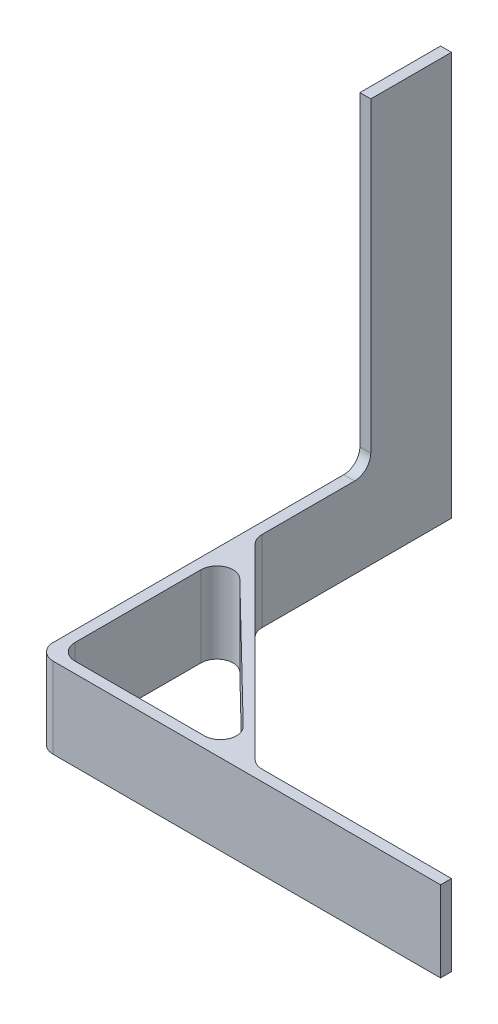
ISO-10303-21;
HEADER;
FILE_DESCRIPTION(('STEP AP214'),'2;1');
FILE_NAME('part.step','',(''),(''),'','','');
FILE_SCHEMA(('AUTOMOTIVE_DESIGN { 1 0 10303 214 1 1 1 1 }'));
ENDSEC;
DATA;
#1=APPLICATION_CONTEXT('core data for automotive mechanical design processes');
#2=APPLICATION_PROTOCOL_DEFINITION('international standard','automotive_design',2000,#1);
#3=PRODUCT_CONTEXT('',#1,'mechanical');
#4=PRODUCT('Part','Part','',(#3));
#5=PRODUCT_RELATED_PRODUCT_CATEGORY('part','',(#4));
#6=PRODUCT_DEFINITION_FORMATION('','',#4);
#7=PRODUCT_DEFINITION_CONTEXT('part definition',#1,'design');
#8=PRODUCT_DEFINITION('design','',#6,#7);
#9=PRODUCT_DEFINITION_SHAPE('','',#8);
#10=(LENGTH_UNIT() NAMED_UNIT(*) SI_UNIT(.MILLI.,.METRE.));
#11=(NAMED_UNIT(*) PLANE_ANGLE_UNIT() SI_UNIT($,.RADIAN.));
#12=(NAMED_UNIT(*) SI_UNIT($,.STERADIAN.) SOLID_ANGLE_UNIT());
#13=UNCERTAINTY_MEASURE_WITH_UNIT(LENGTH_MEASURE(1.E-05),#10,'distance_accuracy_value','');
#14=(GEOMETRIC_REPRESENTATION_CONTEXT(3) GLOBAL_UNCERTAINTY_ASSIGNED_CONTEXT((#13)) GLOBAL_UNIT_ASSIGNED_CONTEXT((#10,
#11,#12)) REPRESENTATION_CONTEXT('',''));
#15=CARTESIAN_POINT('',(0.,0.,0.));
#16=DIRECTION('',(0.,0.,1.));
#17=DIRECTION('',(1.,0.,0.));
#18=AXIS2_PLACEMENT_3D('',#15,#16,#17);
#19=CARTESIAN_POINT('',(0.,50.,0.));
#20=DIRECTION('',(0.,1.,0.));
#21=DIRECTION('',(0.,0.,1.));
#22=AXIS2_PLACEMENT_3D('',#19,#20,#21);
#23=PLANE('',#22);
#24=DIRECTION('',(0.,0.,-1.));
#25=VECTOR('',#24,1.);
#26=CARTESIAN_POINT('',(-243.25,50.,0.));
#27=LINE('',#26,#25);
#28=CARTESIAN_POINT('',(-243.25,50.,-16.7539621198595));
#29=VERTEX_POINT('',#28);
#30=CARTESIAN_POINT('',(-243.25,50.,-94.7328861396077));
#31=VERTEX_POINT('',#30);
#32=EDGE_CURVE('E197',#29,#31,#27,.T.);
#33=ORIENTED_EDGE('',*,*,#32,.T.);
#34=CARTESIAN_POINT('',(-233.25,50.,-94.7328861396077));
#35=DIRECTION('',(0.,1.,0.));
#36=DIRECTION('',(0.,0.,1.));
#37=AXIS2_PLACEMENT_3D('',#34,#35,#36);
#38=CIRCLE('',#37,10.);
#39=CARTESIAN_POINT('',(-226.273738928772,50.,-101.897506259759));
#40=VERTEX_POINT('',#39);
#41=EDGE_CURVE('E269',#31,#40,#38,.F.);
#42=ORIENTED_EDGE('',*,*,#41,.T.);
#43=DIRECTION('',(0.716462012015094,0.,0.697626107122779));
#44=VECTOR('',#43,1.);
#45=CARTESIAN_POINT('',(-121.625,50.,0.));
#46=LINE('',#45,#44);
#47=CARTESIAN_POINT('',(-146.189383960491,50.,-23.9185822400105));
#48=VERTEX_POINT('',#47);
#49=EDGE_CURVE('E188',#40,#48,#46,.T.);
#50=ORIENTED_EDGE('',*,*,#49,.T.);
#51=CARTESIAN_POINT('',(-153.165645031719,50.,-16.7539621198596));
#52=DIRECTION('',(0.,1.,0.));
#53=DIRECTION('',(0.,0.,1.));
#54=AXIS2_PLACEMENT_3D('',#51,#52,#53);
#55=CIRCLE('',#54,10.);
#56=CARTESIAN_POINT('',(-153.165645031719,50.,-6.75396211985955));
#57=VERTEX_POINT('',#56);
#58=EDGE_CURVE('E276',#48,#57,#55,.F.);
#59=ORIENTED_EDGE('',*,*,#58,.T.);
#60=DIRECTION('',(-1.,0.,0.));
#61=VECTOR('',#60,1.);
#62=CARTESIAN_POINT('',(0.,50.,-6.75396211985957));
#63=LINE('',#62,#61);
#64=CARTESIAN_POINT('',(-233.25,50.,-6.75396211985954));
#65=VERTEX_POINT('',#64);
#66=EDGE_CURVE('E216',#57,#65,#63,.T.);
#67=ORIENTED_EDGE('',*,*,#66,.T.);
#68=CARTESIAN_POINT('',(-233.25,50.,-16.7539621198595));
#69=DIRECTION('',(0.,1.,0.));
#70=DIRECTION('',(0.,0.,1.));
#71=AXIS2_PLACEMENT_3D('',#68,#69,#70);
#72=CIRCLE('',#71,10.);
#73=EDGE_CURVE('E260',#65,#29,#72,.F.);
#74=ORIENTED_EDGE('',*,*,#73,.T.);
#75=EDGE_LOOP('',(#33,#42,#50,#59,#67,#74));
#76=FACE_BOUND('',#75,.T.);
#77=CARTESIAN_POINT('',(-243.25,50.,-132.519164391346));
#78=VERTEX_POINT('',#77);
#79=CARTESIAN_POINT('',(-243.25,50.,-190.));
#80=VERTEX_POINT('',#79);
#81=EDGE_CURVE('E201',#78,#80,#27,.T.);
#82=ORIENTED_EDGE('',*,*,#81,.T.);
#83=DIRECTION('',(-1.,0.,0.));
#84=VECTOR('',#83,1.);
#85=CARTESIAN_POINT('',(0.,50.,-190.));
#86=LINE('',#85,#84);
#87=CARTESIAN_POINT('',(-250.,50.,-190.));
#88=VERTEX_POINT('',#87);
#89=EDGE_CURVE('E298',#80,#88,#86,.T.);
#90=ORIENTED_EDGE('',*,*,#89,.T.);
#91=DIRECTION('',(0.,0.,1.));
#92=VECTOR('',#91,1.);
#93=CARTESIAN_POINT('',(-250.,50.,0.));
#94=LINE('',#93,#92);
#95=CARTESIAN_POINT('',(-250.,50.,-9.99999999999997));
#96=VERTEX_POINT('',#95);
#97=EDGE_CURVE('E221',#88,#96,#94,.T.);
#98=ORIENTED_EDGE('',*,*,#97,.T.);
#99=CARTESIAN_POINT('',(-240.,50.,-9.99999999999997));
#100=DIRECTION('',(0.,1.,0.));
#101=DIRECTION('',(0.,0.,1.));
#102=AXIS2_PLACEMENT_3D('',#99,#100,#101);
#103=CIRCLE('',#102,10.);
#104=CARTESIAN_POINT('',(-240.,50.,0.));
#105=VERTEX_POINT('',#104);
#106=EDGE_CURVE('E249',#96,#105,#103,.T.);
#107=ORIENTED_EDGE('',*,*,#106,.T.);
#108=DIRECTION('',(1.,0.,0.));
#109=VECTOR('',#108,1.);
#110=CARTESIAN_POINT('',(0.,50.,0.));
#111=LINE('',#110,#109);
#112=CARTESIAN_POINT('',(0.,50.,0.));
#113=VERTEX_POINT('',#112);
#114=EDGE_CURVE('E223',#105,#113,#111,.T.);
#115=ORIENTED_EDGE('',*,*,#114,.T.);
#116=DIRECTION('',(0.,0.,-1.));
#117=VECTOR('',#116,1.);
#118=CARTESIAN_POINT('',(0.,50.,0.));
#119=LINE('',#118,#117);
#120=CARTESIAN_POINT('',(0.,50.,-6.75396211985957));
#121=VERTEX_POINT('',#120);
#122=EDGE_CURVE('E213',#113,#121,#119,.T.);
#123=ORIENTED_EDGE('',*,*,#122,.T.);
#124=CARTESIAN_POINT('',(-117.482912083794,50.,-6.75396211985955));
#125=VERTEX_POINT('',#124);
#126=EDGE_CURVE('E218',#121,#125,#63,.T.);
#127=ORIENTED_EDGE('',*,*,#126,.T.);
#128=CARTESIAN_POINT('',(-117.482912083794,50.,-16.7539621198596));
#129=DIRECTION('',(0.,1.,0.));
#130=DIRECTION('',(0.,0.,1.));
#131=AXIS2_PLACEMENT_3D('',#128,#129,#130);
#132=CIRCLE('',#131,10.);
#133=CARTESIAN_POINT('',(-124.553922307251,50.,-9.68283672005514));
#134=VERTEX_POINT('',#133);
#135=EDGE_CURVE('E287',#125,#134,#132,.F.);
#136=ORIENTED_EDGE('',*,*,#135,.T.);
#137=DIRECTION('',(-0.707112539980441,0.,-0.707101022345754));
#138=VECTOR('',#137,1.);
#139=CARTESIAN_POINT('',(-243.25,50.,-128.37698105993));
#140=LINE('',#139,#138);
#141=CARTESIAN_POINT('',(-240.321010223458,50.,-125.448038991542));
#142=VERTEX_POINT('',#141);
#143=EDGE_CURVE('E191',#134,#142,#140,.T.);
#144=ORIENTED_EDGE('',*,*,#143,.T.);
#145=CARTESIAN_POINT('',(-233.25,50.,-132.519164391346));
#146=DIRECTION('',(0.,1.,0.));
#147=DIRECTION('',(0.,0.,1.));
#148=AXIS2_PLACEMENT_3D('',#145,#146,#147);
#149=CIRCLE('',#148,10.);
#150=EDGE_CURVE('E296',#142,#78,#149,.F.);
#151=ORIENTED_EDGE('',*,*,#150,.T.);
#152=EDGE_LOOP('',(#82,#90,#98,#107,#115,#123,#127,#136,#144,#151));
#153=FACE_BOUND('',#152,.T.);
#154=ADVANCED_FACE('F33',(#76,#153),#23,.T.);
#155=CARTESIAN_POINT('',(0.,50.,-6.75396211985957));
#156=DIRECTION('',(0.,0.,1.));
#157=DIRECTION('',(1.,0.,0.));
#158=AXIS2_PLACEMENT_3D('',#155,#156,#157);
#159=PLANE('',#158);
#160=ORIENTED_EDGE('',*,*,#66,.F.);
#161=DIRECTION('',(0.,1.,0.));
#162=VECTOR('',#161,1.);
#163=CARTESIAN_POINT('',(-153.165645031719,0.,-6.75396211985955));
#164=LINE('',#163,#162);
#165=CARTESIAN_POINT('',(-153.165645031719,0.,-6.75396211985955));
#166=VERTEX_POINT('',#165);
#167=EDGE_CURVE('E274',#57,#166,#164,.F.);
#168=ORIENTED_EDGE('',*,*,#167,.T.);
#169=DIRECTION('',(-1.,0.,0.));
#170=VECTOR('',#169,1.);
#171=CARTESIAN_POINT('',(0.,0.,-6.75396211985957));
#172=LINE('',#171,#170);
#173=CARTESIAN_POINT('',(-233.25,0.,-6.75396211985954));
#174=VERTEX_POINT('',#173);
#175=EDGE_CURVE('E228',#166,#174,#172,.T.);
#176=ORIENTED_EDGE('',*,*,#175,.T.);
#177=DIRECTION('',(0.,-1.,0.));
#178=VECTOR('',#177,1.);
#179=CARTESIAN_POINT('',(-233.25,50.,-6.75396211985954));
#180=LINE('',#179,#178);
#181=EDGE_CURVE('E254',#174,#65,#180,.F.);
#182=ORIENTED_EDGE('',*,*,#181,.T.);
#183=EDGE_LOOP('',(#160,#168,#176,#182));
#184=FACE_BOUND('',#183,.T.);
#185=ADVANCED_FACE('F350',(#184),#159,.F.);
#186=CARTESIAN_POINT('',(0.,0.,-6.75396211985957));
#187=VERTEX_POINT('',#186);
#188=CARTESIAN_POINT('',(-117.482912083794,0.,-6.75396211985955));
#189=VERTEX_POINT('',#188);
#190=EDGE_CURVE('E229',#187,#189,#172,.T.);
#191=ORIENTED_EDGE('',*,*,#190,.T.);
#192=DIRECTION('',(0.,-1.,0.));
#193=VECTOR('',#192,1.);
#194=CARTESIAN_POINT('',(-117.482912083794,50.,-6.75396211985955));
#195=LINE('',#194,#193);
#196=EDGE_CURVE('E283',#189,#125,#195,.F.);
#197=ORIENTED_EDGE('',*,*,#196,.T.);
#198=ORIENTED_EDGE('',*,*,#126,.F.);
#199=DIRECTION('',(0.,-1.,0.));
#200=VECTOR('',#199,1.);
#201=CARTESIAN_POINT('',(0.,50.,-6.75396211985957));
#202=LINE('',#201,#200);
#203=EDGE_CURVE('E237',#121,#187,#202,.T.);
#204=ORIENTED_EDGE('',*,*,#203,.T.);
#205=EDGE_LOOP('',(#191,#197,#198,#204));
#206=FACE_BOUND('',#205,.T.);
#207=ADVANCED_FACE('F358',(#206),#159,.F.);
#208=CARTESIAN_POINT('',(-243.25,50.,0.));
#209=DIRECTION('',(-1.,0.,0.));
#210=DIRECTION('',(0.,0.,1.));
#211=AXIS2_PLACEMENT_3D('',#208,#209,#210);
#212=PLANE('',#211);
#213=DIRECTION('',(0.,0.,-1.));
#214=VECTOR('',#213,1.);
#215=CARTESIAN_POINT('',(-243.25,0.,0.));
#216=LINE('',#215,#214);
#217=CARTESIAN_POINT('',(-243.25,0.,-16.7539621198595));
#218=VERTEX_POINT('',#217);
#219=CARTESIAN_POINT('',(-243.25,0.,-94.7328861396077));
#220=VERTEX_POINT('',#219);
#221=EDGE_CURVE('E202',#218,#220,#216,.T.);
#222=ORIENTED_EDGE('',*,*,#221,.T.);
#223=DIRECTION('',(0.,-1.,0.));
#224=VECTOR('',#223,1.);
#225=CARTESIAN_POINT('',(-243.25,50.,-94.7328861396077));
#226=LINE('',#225,#224);
#227=EDGE_CURVE('E265',#220,#31,#226,.F.);
#228=ORIENTED_EDGE('',*,*,#227,.T.);
#229=ORIENTED_EDGE('',*,*,#32,.F.);
#230=DIRECTION('',(0.,-1.,0.));
#231=VECTOR('',#230,1.);
#232=CARTESIAN_POINT('',(-243.25,0.,-16.7539621198595));
#233=LINE('',#232,#231);
#234=EDGE_CURVE('E251',#29,#218,#233,.T.);
#235=ORIENTED_EDGE('',*,*,#234,.T.);
#236=EDGE_LOOP('',(#222,#228,#229,#235));
#237=FACE_BOUND('',#236,.T.);
#238=ADVANCED_FACE('F363',(#237),#212,.F.);
#239=DIRECTION('',(0.,-1.,0.));
#240=VECTOR('',#239,1.);
#241=CARTESIAN_POINT('',(-243.25,50.,-250.));
#242=LINE('',#241,#240);
#243=CARTESIAN_POINT('',(-243.25,250.,-250.));
#244=VERTEX_POINT('',#243);
#245=CARTESIAN_POINT('',(-243.25,0.,-250.));
#246=VERTEX_POINT('',#245);
#247=EDGE_CURVE('E209',#244,#246,#242,.T.);
#248=ORIENTED_EDGE('',*,*,#247,.F.);
#249=DIRECTION('',(0.,0.,-1.));
#250=VECTOR('',#249,1.);
#251=CARTESIAN_POINT('',(-243.25,250.,-250.));
#252=LINE('',#251,#250);
#253=CARTESIAN_POINT('',(-243.25,250.,-200.));
#254=VERTEX_POINT('',#253);
#255=EDGE_CURVE('E169',#254,#244,#252,.T.);
#256=ORIENTED_EDGE('',*,*,#255,.F.);
#257=DIRECTION('',(0.,-1.,0.));
#258=VECTOR('',#257,1.);
#259=CARTESIAN_POINT('',(-243.25,250.,-200.));
#260=LINE('',#259,#258);
#261=CARTESIAN_POINT('',(-243.25,60.,-200.));
#262=VERTEX_POINT('',#261);
#263=EDGE_CURVE('E165',#254,#262,#260,.T.);
#264=ORIENTED_EDGE('',*,*,#263,.T.);
#265=CARTESIAN_POINT('',(-243.25,60.,-190.));
#266=DIRECTION('',(-1.,0.,0.));
#267=DIRECTION('',(0.,0.,1.));
#268=AXIS2_PLACEMENT_3D('',#265,#266,#267);
#269=CIRCLE('',#268,10.);
#270=EDGE_CURVE('E11',#262,#80,#269,.T.);
#271=ORIENTED_EDGE('',*,*,#270,.T.);
#272=ORIENTED_EDGE('',*,*,#81,.F.);
#273=DIRECTION('',(0.,-1.,0.));
#274=VECTOR('',#273,1.);
#275=CARTESIAN_POINT('',(-243.25,0.,-132.519164391346));
#276=LINE('',#275,#274);
#277=CARTESIAN_POINT('',(-243.25,0.,-132.519164391346));
#278=VERTEX_POINT('',#277);
#279=EDGE_CURVE('E289',#78,#278,#276,.T.);
#280=ORIENTED_EDGE('',*,*,#279,.T.);
#281=EDGE_CURVE('E193',#278,#246,#216,.T.);
#282=ORIENTED_EDGE('',*,*,#281,.T.);
#283=EDGE_LOOP('',(#248,#256,#264,#271,#272,#280,#282));
#284=FACE_BOUND('',#283,.T.);
#285=ADVANCED_FACE('F343',(#284),#212,.F.);
#286=CARTESIAN_POINT('',(0.,50.,0.));
#287=DIRECTION('',(-1.,0.,0.));
#288=DIRECTION('',(0.,0.,1.));
#289=AXIS2_PLACEMENT_3D('',#286,#287,#288);
#290=PLANE('',#289);
#291=DIRECTION('',(0.,0.,-1.));
#292=VECTOR('',#291,1.);
#293=CARTESIAN_POINT('',(0.,0.,0.));
#294=LINE('',#293,#292);
#295=CARTESIAN_POINT('',(0.,0.,0.));
#296=VERTEX_POINT('',#295);
#297=EDGE_CURVE('E212',#296,#187,#294,.T.);
#298=ORIENTED_EDGE('',*,*,#297,.T.);
#299=ORIENTED_EDGE('',*,*,#203,.F.);
#300=ORIENTED_EDGE('',*,*,#122,.F.);
#301=DIRECTION('',(0.,-1.,0.));
#302=VECTOR('',#301,1.);
#303=CARTESIAN_POINT('',(0.,50.,0.));
#304=LINE('',#303,#302);
#305=EDGE_CURVE('E225',#113,#296,#304,.T.);
#306=ORIENTED_EDGE('',*,*,#305,.T.);
#307=EDGE_LOOP('',(#298,#299,#300,#306));
#308=FACE_BOUND('',#307,.T.);
#309=ADVANCED_FACE('F321',(#308),#290,.F.);
#310=CARTESIAN_POINT('',(-250.,50.,0.));
#311=DIRECTION('',(1.,0.,0.));
#312=DIRECTION('',(0.,0.,-1.));
#313=AXIS2_PLACEMENT_3D('',#310,#311,#312);
#314=PLANE('',#313);
#315=DIRECTION('',(0.,0.,1.));
#316=VECTOR('',#315,1.);
#317=CARTESIAN_POINT('',(-250.,0.,0.));
#318=LINE('',#317,#316);
#319=CARTESIAN_POINT('',(-250.,0.,-250.));
#320=VERTEX_POINT('',#319);
#321=CARTESIAN_POINT('',(-250.,0.,-9.99999999999997));
#322=VERTEX_POINT('',#321);
#323=EDGE_CURVE('E232',#320,#322,#318,.T.);
#324=ORIENTED_EDGE('',*,*,#323,.T.);
#325=DIRECTION('',(0.,-1.,0.));
#326=VECTOR('',#325,1.);
#327=CARTESIAN_POINT('',(-250.,50.,-9.99999999999997));
#328=LINE('',#327,#326);
#329=EDGE_CURVE('E246',#322,#96,#328,.F.);
#330=ORIENTED_EDGE('',*,*,#329,.T.);
#331=ORIENTED_EDGE('',*,*,#97,.F.);
#332=CARTESIAN_POINT('',(-250.,60.,-190.));
#333=DIRECTION('',(1.,0.,0.));
#334=DIRECTION('',(0.,0.,-1.));
#335=AXIS2_PLACEMENT_3D('',#332,#333,#334);
#336=CIRCLE('',#335,10.);
#337=CARTESIAN_POINT('',(-250.,60.,-200.));
#338=VERTEX_POINT('',#337);
#339=EDGE_CURVE('E41',#88,#338,#336,.T.);
#340=ORIENTED_EDGE('',*,*,#339,.T.);
#341=DIRECTION('',(0.,-1.,0.));
#342=VECTOR('',#341,1.);
#343=CARTESIAN_POINT('',(-250.,250.,-200.));
#344=LINE('',#343,#342);
#345=CARTESIAN_POINT('',(-250.,250.,-200.));
#346=VERTEX_POINT('',#345);
#347=EDGE_CURVE('E164',#346,#338,#344,.T.);
#348=ORIENTED_EDGE('',*,*,#347,.F.);
#349=DIRECTION('',(0.,0.,1.));
#350=VECTOR('',#349,1.);
#351=CARTESIAN_POINT('',(-250.,250.,-250.));
#352=LINE('',#351,#350);
#353=CARTESIAN_POINT('',(-250.,250.,-250.));
#354=VERTEX_POINT('',#353);
#355=EDGE_CURVE('E170',#354,#346,#352,.T.);
#356=ORIENTED_EDGE('',*,*,#355,.F.);
#357=DIRECTION('',(0.,-1.,0.));
#358=VECTOR('',#357,1.);
#359=CARTESIAN_POINT('',(-250.,50.,-250.));
#360=LINE('',#359,#358);
#361=EDGE_CURVE('E200',#354,#320,#360,.T.);
#362=ORIENTED_EDGE('',*,*,#361,.T.);
#363=EDGE_LOOP('',(#324,#330,#331,#340,#348,#356,#362));
#364=FACE_BOUND('',#363,.T.);
#365=ADVANCED_FACE('F179',(#364),#314,.F.);
#366=CARTESIAN_POINT('',(0.,50.,0.));
#367=DIRECTION('',(0.,0.,-1.));
#368=DIRECTION('',(-1.,0.,0.));
#369=AXIS2_PLACEMENT_3D('',#366,#367,#368);
#370=PLANE('',#369);
#371=ORIENTED_EDGE('',*,*,#114,.F.);
#372=DIRECTION('',(0.,-1.,0.));
#373=VECTOR('',#372,1.);
#374=CARTESIAN_POINT('',(-240.,50.,0.));
#375=LINE('',#374,#373);
#376=CARTESIAN_POINT('',(-240.,0.,0.));
#377=VERTEX_POINT('',#376);
#378=EDGE_CURVE('E240',#105,#377,#375,.T.);
#379=ORIENTED_EDGE('',*,*,#378,.T.);
#380=DIRECTION('',(1.,0.,0.));
#381=VECTOR('',#380,1.);
#382=CARTESIAN_POINT('',(0.,0.,0.));
#383=LINE('',#382,#381);
#384=EDGE_CURVE('E217',#377,#296,#383,.T.);
#385=ORIENTED_EDGE('',*,*,#384,.T.);
#386=ORIENTED_EDGE('',*,*,#305,.F.);
#387=EDGE_LOOP('',(#371,#379,#385,#386));
#388=FACE_BOUND('',#387,.T.);
#389=ADVANCED_FACE('F315',(#388),#370,.F.);
#390=CARTESIAN_POINT('',(0.,0.,0.));
#391=DIRECTION('',(0.,1.,0.));
#392=DIRECTION('',(0.,0.,1.));
#393=AXIS2_PLACEMENT_3D('',#390,#391,#392);
#394=PLANE('',#393);
#395=DIRECTION('',(-1.,0.,0.));
#396=VECTOR('',#395,1.);
#397=CARTESIAN_POINT('',(-250.,0.,-250.));
#398=LINE('',#397,#396);
#399=EDGE_CURVE('E205',#246,#320,#398,.T.);
#400=ORIENTED_EDGE('',*,*,#399,.F.);
#401=ORIENTED_EDGE('',*,*,#281,.F.);
#402=CARTESIAN_POINT('',(-233.25,0.,-132.519164391346));
#403=DIRECTION('',(0.,1.,0.));
#404=DIRECTION('',(0.,0.,1.));
#405=AXIS2_PLACEMENT_3D('',#402,#403,#404);
#406=CIRCLE('',#405,10.);
#407=CARTESIAN_POINT('',(-240.321010223458,0.,-125.448038991542));
#408=VERTEX_POINT('',#407);
#409=EDGE_CURVE('E294',#278,#408,#406,.T.);
#410=ORIENTED_EDGE('',*,*,#409,.T.);
#411=DIRECTION('',(-0.707112539980441,0.,-0.707101022345754));
#412=VECTOR('',#411,1.);
#413=CARTESIAN_POINT('',(-243.25,0.,-128.37698105993));
#414=LINE('',#413,#412);
#415=CARTESIAN_POINT('',(-124.553922307251,0.,-9.68283672005514));
#416=VERTEX_POINT('',#415);
#417=EDGE_CURVE('E183',#416,#408,#414,.T.);
#418=ORIENTED_EDGE('',*,*,#417,.F.);
#419=CARTESIAN_POINT('',(-117.482912083794,0.,-16.7539621198596));
#420=DIRECTION('',(0.,1.,0.));
#421=DIRECTION('',(0.,0.,1.));
#422=AXIS2_PLACEMENT_3D('',#419,#420,#421);
#423=CIRCLE('',#422,10.);
#424=EDGE_CURVE('E285',#416,#189,#423,.T.);
#425=ORIENTED_EDGE('',*,*,#424,.T.);
#426=ORIENTED_EDGE('',*,*,#190,.F.);
#427=ORIENTED_EDGE('',*,*,#297,.F.);
#428=ORIENTED_EDGE('',*,*,#384,.F.);
#429=CARTESIAN_POINT('',(-240.,0.,-9.99999999999997));
#430=DIRECTION('',(0.,1.,0.));
#431=DIRECTION('',(0.,0.,1.));
#432=AXIS2_PLACEMENT_3D('',#429,#430,#431);
#433=CIRCLE('',#432,10.);
#434=EDGE_CURVE('E243',#377,#322,#433,.F.);
#435=ORIENTED_EDGE('',*,*,#434,.T.);
#436=ORIENTED_EDGE('',*,*,#323,.F.);
#437=EDGE_LOOP('',(#400,#401,#410,#418,#425,#426,#427,#428,#435,#436));
#438=FACE_BOUND('',#437,.T.);
#439=ORIENTED_EDGE('',*,*,#175,.F.);
#440=CARTESIAN_POINT('',(-153.165645031719,0.,-16.7539621198596));
#441=DIRECTION('',(0.,1.,0.));
#442=DIRECTION('',(0.,0.,1.));
#443=AXIS2_PLACEMENT_3D('',#440,#441,#442);
#444=CIRCLE('',#443,10.);
#445=CARTESIAN_POINT('',(-146.189383960491,0.,-23.9185822400105));
#446=VERTEX_POINT('',#445);
#447=EDGE_CURVE('E278',#166,#446,#444,.T.);
#448=ORIENTED_EDGE('',*,*,#447,.T.);
#449=DIRECTION('',(0.716462012015094,0.,0.697626107122779));
#450=VECTOR('',#449,1.);
#451=CARTESIAN_POINT('',(-121.625,0.,0.));
#452=LINE('',#451,#450);
#453=CARTESIAN_POINT('',(-226.273738928772,0.,-101.897506259759));
#454=VERTEX_POINT('',#453);
#455=EDGE_CURVE('E180',#454,#446,#452,.T.);
#456=ORIENTED_EDGE('',*,*,#455,.F.);
#457=CARTESIAN_POINT('',(-233.25,0.,-94.7328861396077));
#458=DIRECTION('',(0.,1.,0.));
#459=DIRECTION('',(0.,0.,1.));
#460=AXIS2_PLACEMENT_3D('',#457,#458,#459);
#461=CIRCLE('',#460,10.);
#462=EDGE_CURVE('E267',#454,#220,#461,.T.);
#463=ORIENTED_EDGE('',*,*,#462,.T.);
#464=ORIENTED_EDGE('',*,*,#221,.F.);
#465=CARTESIAN_POINT('',(-233.25,0.,-16.7539621198595));
#466=DIRECTION('',(0.,1.,0.));
#467=DIRECTION('',(0.,0.,1.));
#468=AXIS2_PLACEMENT_3D('',#465,#466,#467);
#469=CIRCLE('',#468,10.);
#470=EDGE_CURVE('E257',#218,#174,#469,.T.);
#471=ORIENTED_EDGE('',*,*,#470,.T.);
#472=EDGE_LOOP('',(#439,#448,#456,#463,#464,#471));
#473=FACE_BOUND('',#472,.T.);
#474=ADVANCED_FACE('F335',(#438,#473),#394,.F.);
#475=CARTESIAN_POINT('',(-250.,50.,-250.));
#476=DIRECTION('',(0.,0.,1.));
#477=DIRECTION('',(1.,0.,0.));
#478=AXIS2_PLACEMENT_3D('',#475,#476,#477);
#479=PLANE('',#478);
#480=ORIENTED_EDGE('',*,*,#399,.T.);
#481=ORIENTED_EDGE('',*,*,#361,.F.);
#482=DIRECTION('',(-1.,0.,0.));
#483=VECTOR('',#482,1.);
#484=CARTESIAN_POINT('',(-250.,250.,-250.));
#485=LINE('',#484,#483);
#486=EDGE_CURVE('E176',#244,#354,#485,.T.);
#487=ORIENTED_EDGE('',*,*,#486,.F.);
#488=ORIENTED_EDGE('',*,*,#247,.T.);
#489=EDGE_LOOP('',(#480,#481,#487,#488));
#490=FACE_BOUND('',#489,.T.);
#491=ADVANCED_FACE('F367',(#490),#479,.F.);
#492=CARTESIAN_POINT('',(-121.625,50.,0.));
#493=DIRECTION('',(0.697626107122779,0.,-0.716462012015094));
#494=DIRECTION('',(-0.716462012015094,0.,-0.697626107122779));
#495=AXIS2_PLACEMENT_3D('',#492,#493,#494);
#496=PLANE('',#495);
#497=ORIENTED_EDGE('',*,*,#455,.T.);
#498=DIRECTION('',(0.,1.,0.));
#499=VECTOR('',#498,1.);
#500=CARTESIAN_POINT('',(-146.189383960491,50.,-23.9185822400105));
#501=LINE('',#500,#499);
#502=EDGE_CURVE('E271',#446,#48,#501,.T.);
#503=ORIENTED_EDGE('',*,*,#502,.T.);
#504=ORIENTED_EDGE('',*,*,#49,.F.);
#505=DIRECTION('',(0.,-1.,0.));
#506=VECTOR('',#505,1.);
#507=CARTESIAN_POINT('',(-226.273738928772,0.,-101.897506259759));
#508=LINE('',#507,#506);
#509=EDGE_CURVE('E262',#40,#454,#508,.T.);
#510=ORIENTED_EDGE('',*,*,#509,.T.);
#511=EDGE_LOOP('',(#497,#503,#504,#510));
#512=FACE_BOUND('',#511,.T.);
#513=ADVANCED_FACE('F401',(#512),#496,.F.);
#514=CARTESIAN_POINT('',(-243.25,50.,-128.37698105993));
#515=DIRECTION('',(-0.707101022345753,0.,0.707112539980441));
#516=DIRECTION('',(0.707112539980441,0.,0.707101022345753));
#517=AXIS2_PLACEMENT_3D('',#514,#515,#516);
#518=PLANE('',#517);
#519=ORIENTED_EDGE('',*,*,#417,.T.);
#520=DIRECTION('',(0.,-1.,0.));
#521=VECTOR('',#520,1.);
#522=CARTESIAN_POINT('',(-240.321010223458,50.,-125.448038991542));
#523=LINE('',#522,#521);
#524=EDGE_CURVE('E292',#408,#142,#523,.F.);
#525=ORIENTED_EDGE('',*,*,#524,.T.);
#526=ORIENTED_EDGE('',*,*,#143,.F.);
#527=DIRECTION('',(0.,-1.,0.));
#528=VECTOR('',#527,1.);
#529=CARTESIAN_POINT('',(-124.553922307251,0.,-9.68283672005517));
#530=LINE('',#529,#528);
#531=EDGE_CURVE('E280',#134,#416,#530,.T.);
#532=ORIENTED_EDGE('',*,*,#531,.T.);
#533=EDGE_LOOP('',(#519,#525,#526,#532));
#534=FACE_BOUND('',#533,.T.);
#535=ADVANCED_FACE('F331',(#534),#518,.F.);
#536=CARTESIAN_POINT('',(-240.,50.,-9.99999999999997));
#537=DIRECTION('',(0.,-1.,0.));
#538=DIRECTION('',(0.,0.,-1.));
#539=AXIS2_PLACEMENT_3D('',#536,#537,#538);
#540=CYLINDRICAL_SURFACE('',#539,10.);
#541=ORIENTED_EDGE('',*,*,#106,.F.);
#542=ORIENTED_EDGE('',*,*,#329,.F.);
#543=ORIENTED_EDGE('',*,*,#434,.F.);
#544=ORIENTED_EDGE('',*,*,#378,.F.);
#545=EDGE_LOOP('',(#541,#542,#543,#544));
#546=FACE_BOUND('',#545,.T.);
#547=ADVANCED_FACE('F311',(#546),#540,.T.);
#548=CARTESIAN_POINT('',(-233.25,50.,-16.7539621198595));
#549=DIRECTION('',(0.,1.,0.));
#550=DIRECTION('',(0.,0.,1.));
#551=AXIS2_PLACEMENT_3D('',#548,#549,#550);
#552=CYLINDRICAL_SURFACE('',#551,10.);
#553=ORIENTED_EDGE('',*,*,#73,.F.);
#554=ORIENTED_EDGE('',*,*,#181,.F.);
#555=ORIENTED_EDGE('',*,*,#470,.F.);
#556=ORIENTED_EDGE('',*,*,#234,.F.);
#557=EDGE_LOOP('',(#553,#554,#555,#556));
#558=FACE_BOUND('',#557,.T.);
#559=ADVANCED_FACE('F376',(#558),#552,.F.);
#560=CARTESIAN_POINT('',(-233.25,50.,-94.7328861396077));
#561=DIRECTION('',(0.,1.,0.));
#562=DIRECTION('',(0.,0.,1.));
#563=AXIS2_PLACEMENT_3D('',#560,#561,#562);
#564=CYLINDRICAL_SURFACE('',#563,10.);
#565=ORIENTED_EDGE('',*,*,#41,.F.);
#566=ORIENTED_EDGE('',*,*,#227,.F.);
#567=ORIENTED_EDGE('',*,*,#462,.F.);
#568=ORIENTED_EDGE('',*,*,#509,.F.);
#569=EDGE_LOOP('',(#565,#566,#567,#568));
#570=FACE_BOUND('',#569,.T.);
#571=ADVANCED_FACE('F379',(#570),#564,.F.);
#572=CARTESIAN_POINT('',(-153.165645031719,50.,-16.7539621198596));
#573=DIRECTION('',(0.,-1.,0.));
#574=DIRECTION('',(0.,0.,-1.));
#575=AXIS2_PLACEMENT_3D('',#572,#573,#574);
#576=CYLINDRICAL_SURFACE('',#575,10.);
#577=ORIENTED_EDGE('',*,*,#447,.F.);
#578=ORIENTED_EDGE('',*,*,#167,.F.);
#579=ORIENTED_EDGE('',*,*,#58,.F.);
#580=ORIENTED_EDGE('',*,*,#502,.F.);
#581=EDGE_LOOP('',(#577,#578,#579,#580));
#582=FACE_BOUND('',#581,.T.);
#583=ADVANCED_FACE('F383',(#582),#576,.F.);
#584=CARTESIAN_POINT('',(-117.482912083794,50.,-16.7539621198596));
#585=DIRECTION('',(0.,1.,0.));
#586=DIRECTION('',(0.,0.,1.));
#587=AXIS2_PLACEMENT_3D('',#584,#585,#586);
#588=CYLINDRICAL_SURFACE('',#587,10.);
#589=ORIENTED_EDGE('',*,*,#135,.F.);
#590=ORIENTED_EDGE('',*,*,#196,.F.);
#591=ORIENTED_EDGE('',*,*,#424,.F.);
#592=ORIENTED_EDGE('',*,*,#531,.F.);
#593=EDGE_LOOP('',(#589,#590,#591,#592));
#594=FACE_BOUND('',#593,.T.);
#595=ADVANCED_FACE('F328',(#594),#588,.F.);
#596=CARTESIAN_POINT('',(-233.25,50.,-132.519164391346));
#597=DIRECTION('',(0.,1.,0.));
#598=DIRECTION('',(0.,0.,1.));
#599=AXIS2_PLACEMENT_3D('',#596,#597,#598);
#600=CYLINDRICAL_SURFACE('',#599,10.);
#601=ORIENTED_EDGE('',*,*,#150,.F.);
#602=ORIENTED_EDGE('',*,*,#524,.F.);
#603=ORIENTED_EDGE('',*,*,#409,.F.);
#604=ORIENTED_EDGE('',*,*,#279,.F.);
#605=EDGE_LOOP('',(#601,#602,#603,#604));
#606=FACE_BOUND('',#605,.T.);
#607=ADVANCED_FACE('F341',(#606),#600,.F.);
#608=CARTESIAN_POINT('',(-250.,250.,-200.));
#609=DIRECTION('',(0.,0.,-1.));
#610=DIRECTION('',(-1.,0.,0.));
#611=AXIS2_PLACEMENT_3D('',#608,#609,#610);
#612=PLANE('',#611);
#613=ORIENTED_EDGE('',*,*,#347,.T.);
#614=DIRECTION('',(-1.,0.,0.));
#615=VECTOR('',#614,1.);
#616=CARTESIAN_POINT('',(-250.,60.,-200.));
#617=LINE('',#616,#615);
#618=EDGE_CURVE('E54',#338,#262,#617,.F.);
#619=ORIENTED_EDGE('',*,*,#618,.T.);
#620=ORIENTED_EDGE('',*,*,#263,.F.);
#621=DIRECTION('',(1.,0.,0.));
#622=VECTOR('',#621,1.);
#623=CARTESIAN_POINT('',(-250.,250.,-200.));
#624=LINE('',#623,#622);
#625=EDGE_CURVE('E161',#346,#254,#624,.T.);
#626=ORIENTED_EDGE('',*,*,#625,.F.);
#627=EDGE_LOOP('',(#613,#619,#620,#626));
#628=FACE_BOUND('',#627,.T.);
#629=ADVANCED_FACE('F163',(#628),#612,.F.);
#630=CARTESIAN_POINT('',(0.,250.,0.));
#631=DIRECTION('',(0.,1.,0.));
#632=DIRECTION('',(0.,0.,1.));
#633=AXIS2_PLACEMENT_3D('',#630,#631,#632);
#634=PLANE('',#633);
#635=ORIENTED_EDGE('',*,*,#355,.T.);
#636=ORIENTED_EDGE('',*,*,#625,.T.);
#637=ORIENTED_EDGE('',*,*,#255,.T.);
#638=ORIENTED_EDGE('',*,*,#486,.T.);
#639=EDGE_LOOP('',(#635,#636,#637,#638));
#640=FACE_BOUND('',#639,.T.);
#641=ADVANCED_FACE('F174',(#640),#634,.T.);
#642=CARTESIAN_POINT('',(0.,60.,-190.));
#643=DIRECTION('',(-1.,0.,0.));
#644=DIRECTION('',(0.,0.,1.));
#645=AXIS2_PLACEMENT_3D('',#642,#643,#644);
#646=CYLINDRICAL_SURFACE('',#645,10.);
#647=ORIENTED_EDGE('',*,*,#270,.F.);
#648=ORIENTED_EDGE('',*,*,#618,.F.);
#649=ORIENTED_EDGE('',*,*,#339,.F.);
#650=ORIENTED_EDGE('',*,*,#89,.F.);
#651=EDGE_LOOP('',(#647,#648,#649,#650));
#652=FACE_BOUND('',#651,.T.);
#653=ADVANCED_FACE('F35',(#652),#646,.F.);
#654=CLOSED_SHELL('',(#154,#185,#207,#238,#285,#309,#365,#389,#474,#491,#513,#535,#547,#559,
#571,#583,#595,#607,#629,#641,#653));
#655=MANIFOLD_SOLID_BREP('B2',#654);
#656=ADVANCED_BREP_SHAPE_REPRESENTATION('',(#18,#655),#14);
#657=SHAPE_DEFINITION_REPRESENTATION(#9,#656);
ENDSEC;
END-ISO-10303-21;
